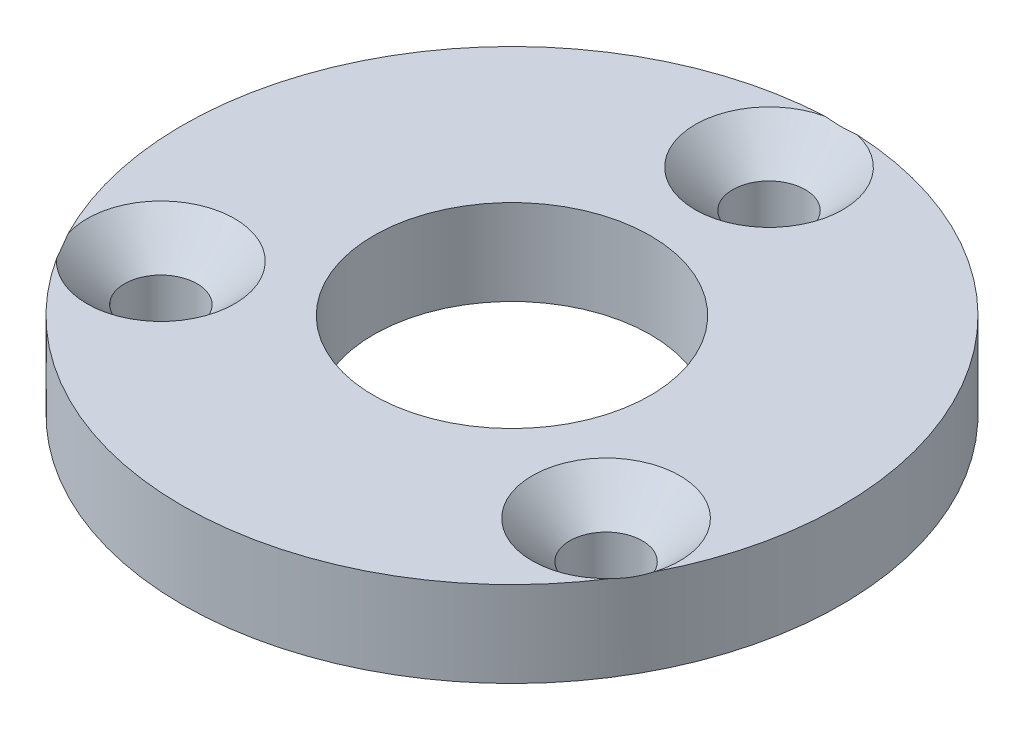
ISO-10303-21;
HEADER;
FILE_DESCRIPTION(('STEP AP214'),'2;1');
FILE_NAME('part.step','',(''),(''),'','','');
FILE_SCHEMA(('AUTOMOTIVE_DESIGN { 1 0 10303 214 1 1 1 1 }'));
ENDSEC;
DATA;
#1=APPLICATION_CONTEXT('core data for automotive mechanical design processes');
#2=APPLICATION_PROTOCOL_DEFINITION('international standard','automotive_design',2000,#1);
#3=PRODUCT_CONTEXT('',#1,'mechanical');
#4=PRODUCT('Part','Part','',(#3));
#5=PRODUCT_RELATED_PRODUCT_CATEGORY('part','',(#4));
#6=PRODUCT_DEFINITION_FORMATION('','',#4);
#7=PRODUCT_DEFINITION_CONTEXT('part definition',#1,'design');
#8=PRODUCT_DEFINITION('design','',#6,#7);
#9=PRODUCT_DEFINITION_SHAPE('','',#8);
#10=(LENGTH_UNIT() NAMED_UNIT(*) SI_UNIT(.MILLI.,.METRE.));
#11=(NAMED_UNIT(*) PLANE_ANGLE_UNIT() SI_UNIT($,.RADIAN.));
#12=(NAMED_UNIT(*) SI_UNIT($,.STERADIAN.) SOLID_ANGLE_UNIT());
#13=UNCERTAINTY_MEASURE_WITH_UNIT(LENGTH_MEASURE(1.E-05),#10,'distance_accuracy_value','');
#14=(GEOMETRIC_REPRESENTATION_CONTEXT(3) GLOBAL_UNCERTAINTY_ASSIGNED_CONTEXT((#13)) GLOBAL_UNIT_ASSIGNED_CONTEXT((#10,
#11,#12)) REPRESENTATION_CONTEXT('',''));
#15=CARTESIAN_POINT('',(0.,0.,0.));
#16=DIRECTION('',(0.,0.,1.));
#17=DIRECTION('',(1.,0.,0.));
#18=AXIS2_PLACEMENT_3D('',#15,#16,#17);
#19=CARTESIAN_POINT('',(0.,6.5,0.));
#20=DIRECTION('',(0.,1.,0.));
#21=DIRECTION('',(0.,0.,1.));
#22=AXIS2_PLACEMENT_3D('',#19,#20,#21);
#23=PLANE('',#22);
#24=CARTESIAN_POINT('',(-16.8874953737966,6.5,9.74999999999984));
#25=DIRECTION('',(0.,1.,0.));
#26=DIRECTION('',(0.,0.,1.));
#27=AXIS2_PLACEMENT_3D('',#24,#25,#26);
#28=CIRCLE('',#27,5.6);
#29=CARTESIAN_POINT('',(-21.0296925270487,6.5,13.518580998677));
#30=VERTEX_POINT('',#29);
#31=CARTESIAN_POINT('',(-22.2222808314964,6.5,11.4529574628612));
#32=VERTEX_POINT('',#31);
#33=EDGE_CURVE('E63',#30,#32,#28,.T.);
#34=ORIENTED_EDGE('',*,*,#33,.F.);
#35=CARTESIAN_POINT('',(0.,6.5,0.));
#36=DIRECTION('',(0.,1.,0.));
#37=DIRECTION('',(0.,0.,1.));
#38=AXIS2_PLACEMENT_3D('',#35,#36,#37);
#39=CIRCLE('',#38,25.);
#40=CARTESIAN_POINT('',(21.0296925270486,6.5,13.5185809986772));
#41=VERTEX_POINT('',#40);
#42=EDGE_CURVE('E69',#30,#41,#39,.T.);
#43=ORIENTED_EDGE('',*,*,#42,.T.);
#44=CARTESIAN_POINT('',(16.8874953737965,6.5,9.75000000000008));
#45=DIRECTION('',(0.,1.,0.));
#46=DIRECTION('',(0.,0.,1.));
#47=AXIS2_PLACEMENT_3D('',#44,#45,#46);
#48=CIRCLE('',#47,5.6);
#49=CARTESIAN_POINT('',(22.2222808314963,6.5,11.4529574628614));
#50=VERTEX_POINT('',#49);
#51=EDGE_CURVE('E168',#50,#41,#48,.T.);
#52=ORIENTED_EDGE('',*,*,#51,.F.);
#53=CARTESIAN_POINT('',(1.19258830444764,6.5,-24.9715384615385));
#54=VERTEX_POINT('',#53);
#55=EDGE_CURVE('E93',#50,#54,#39,.T.);
#56=ORIENTED_EDGE('',*,*,#55,.T.);
#57=CARTESIAN_POINT('',(0.,6.5,-19.5));
#58=DIRECTION('',(0.,1.,0.));
#59=DIRECTION('',(0.,0.,1.));
#60=AXIS2_PLACEMENT_3D('',#57,#58,#59);
#61=CIRCLE('',#60,5.6);
#62=CARTESIAN_POINT('',(-1.19258830444772,6.5,-24.9715384615384));
#63=VERTEX_POINT('',#62);
#64=EDGE_CURVE('E159',#63,#54,#61,.T.);
#65=ORIENTED_EDGE('',*,*,#64,.F.);
#66=EDGE_CURVE('E87',#63,#32,#39,.T.);
#67=ORIENTED_EDGE('',*,*,#66,.T.);
#68=EDGE_LOOP('',(#34,#43,#52,#56,#65,#67));
#69=FACE_BOUND('',#68,.T.);
#70=CARTESIAN_POINT('',(0.,6.5,0.));
#71=DIRECTION('',(0.,1.,0.));
#72=DIRECTION('',(0.,0.,1.));
#73=AXIS2_PLACEMENT_3D('',#70,#71,#72);
#74=CIRCLE('',#73,10.5);
#75=CARTESIAN_POINT('',(0.,6.5,-10.5));
#76=VERTEX_POINT('',#75);
#77=EDGE_CURVE('E103',#76,#76,#74,.T.);
#78=ORIENTED_EDGE('',*,*,#77,.F.);
#79=EDGE_LOOP('',(#78));
#80=FACE_BOUND('',#79,.T.);
#81=ADVANCED_FACE('F43',(#69,#80),#23,.T.);
#82=CARTESIAN_POINT('',(0.,0.,0.));
#83=DIRECTION('',(0.,1.,0.));
#84=DIRECTION('',(0.,0.,1.));
#85=AXIS2_PLACEMENT_3D('',#82,#83,#84);
#86=PLANE('',#85);
#87=CARTESIAN_POINT('',(-16.8874953737966,0.,9.74999999999984));
#88=DIRECTION('',(0.,1.,0.));
#89=DIRECTION('',(0.,0.,1.));
#90=AXIS2_PLACEMENT_3D('',#87,#88,#89);
#91=CIRCLE('',#90,2.75);
#92=CARTESIAN_POINT('',(-16.8874953737966,0.,12.4999999999998));
#93=VERTEX_POINT('',#92);
#94=EDGE_CURVE('E141',#93,#93,#91,.T.);
#95=ORIENTED_EDGE('',*,*,#94,.T.);
#96=EDGE_LOOP('',(#95));
#97=FACE_BOUND('',#96,.T.);
#98=CARTESIAN_POINT('',(16.8874953737965,0.,9.75000000000008));
#99=DIRECTION('',(0.,1.,0.));
#100=DIRECTION('',(0.,0.,1.));
#101=AXIS2_PLACEMENT_3D('',#98,#99,#100);
#102=CIRCLE('',#101,2.75);
#103=CARTESIAN_POINT('',(16.8874953737965,0.,12.5000000000001));
#104=VERTEX_POINT('',#103);
#105=EDGE_CURVE('E145',#104,#104,#102,.T.);
#106=ORIENTED_EDGE('',*,*,#105,.T.);
#107=EDGE_LOOP('',(#106));
#108=FACE_BOUND('',#107,.T.);
#109=CARTESIAN_POINT('',(0.,0.,-19.5));
#110=DIRECTION('',(0.,1.,0.));
#111=DIRECTION('',(0.,0.,1.));
#112=AXIS2_PLACEMENT_3D('',#109,#110,#111);
#113=CIRCLE('',#112,2.75);
#114=CARTESIAN_POINT('',(0.,0.,-16.75));
#115=VERTEX_POINT('',#114);
#116=EDGE_CURVE('E149',#115,#115,#113,.T.);
#117=ORIENTED_EDGE('',*,*,#116,.T.);
#118=EDGE_LOOP('',(#117));
#119=FACE_BOUND('',#118,.T.);
#120=CARTESIAN_POINT('',(0.,0.,0.));
#121=DIRECTION('',(0.,1.,0.));
#122=DIRECTION('',(0.,0.,1.));
#123=AXIS2_PLACEMENT_3D('',#120,#121,#122);
#124=CIRCLE('',#123,25.);
#125=CARTESIAN_POINT('',(0.,0.,25.));
#126=VERTEX_POINT('',#125);
#127=EDGE_CURVE('E96',#126,#126,#124,.T.);
#128=ORIENTED_EDGE('',*,*,#127,.F.);
#129=EDGE_LOOP('',(#128));
#130=FACE_BOUND('',#129,.T.);
#131=CARTESIAN_POINT('',(0.,0.,0.));
#132=DIRECTION('',(0.,1.,0.));
#133=DIRECTION('',(0.,0.,1.));
#134=AXIS2_PLACEMENT_3D('',#131,#132,#133);
#135=CIRCLE('',#134,10.5);
#136=CARTESIAN_POINT('',(0.,0.,-10.5));
#137=VERTEX_POINT('',#136);
#138=EDGE_CURVE('E99',#137,#137,#135,.T.);
#139=ORIENTED_EDGE('',*,*,#138,.T.);
#140=EDGE_LOOP('',(#139));
#141=FACE_BOUND('',#140,.T.);
#142=ADVANCED_FACE('F132',(#97,#108,#119,#130,#141),#86,.F.);
#143=CARTESIAN_POINT('',(0.,6.5,0.));
#144=DIRECTION('',(0.,-1.,0.));
#145=DIRECTION('',(0.,0.,-1.));
#146=AXIS2_PLACEMENT_3D('',#143,#144,#145);
#147=CYLINDRICAL_SURFACE('',#146,25.);
#148=ORIENTED_EDGE('',*,*,#42,.F.);
#149=CARTESIAN_POINT('',(-17.927073801232,8.64478401629333,17.4246958345098));
#150=CARTESIAN_POINT('',(-18.0361968243042,8.54819589595198,17.3124221484397));
#151=CARTESIAN_POINT('',(-18.144820406766,8.45286492083121,17.198560881914));
#152=CARTESIAN_POINT('',(-18.3611373090782,8.26522878693702,16.9674317320035));
#153=CARTESIAN_POINT('',(-18.4688303572154,8.17292449132593,16.8501628945102));
#154=CARTESIAN_POINT('',(-18.6839362345262,7.99136567461168,16.611336404931));
#155=CARTESIAN_POINT('',(-18.7913435098031,7.90213276356399,16.48975724964));
#156=CARTESIAN_POINT('',(-19.0052445867549,7.72801026314842,16.2427637082828));
#157=CARTESIAN_POINT('',(-19.1117384645833,7.64312030870229,16.1173496460078));
#158=CARTESIAN_POINT('',(-19.3247943740408,7.47777476713479,15.8612829908372));
#159=CARTESIAN_POINT('',(-19.4313485408889,7.39736548693882,15.7305936500127));
#160=CARTESIAN_POINT('',(-19.6435347902216,7.24286170424409,15.4648145484702));
#161=CARTESIAN_POINT('',(-19.7491667340311,7.16876813724705,15.3297241399352));
#162=CARTESIAN_POINT('',(-20.064098424858,6.95814140611993,14.9181417102118));
#163=CARTESIAN_POINT('',(-20.2720884137402,6.83274033112642,14.6345555943163));
#164=CARTESIAN_POINT('',(-20.5238814961714,6.70459165063312,14.2750454113065));
#165=CARTESIAN_POINT('',(-20.57041679627,6.68192035509554,14.2079090387369));
#166=CARTESIAN_POINT('',(-20.6631720417593,6.63889793047044,14.072670013618));
#167=CARTESIAN_POINT('',(-20.7093919760469,6.61854688268003,14.0045673273049));
#168=CARTESIAN_POINT('',(-20.801420330688,6.58033657142761,13.867505822086));
#169=CARTESIAN_POINT('',(-20.8472291517469,6.56247456024489,13.7985480402441));
#170=CARTESIAN_POINT('',(-20.9384470022222,6.52935161073006,13.659734286913));
#171=CARTESIAN_POINT('',(-20.983855951641,6.51409118213649,13.5898781422809));
#172=CARTESIAN_POINT('',(-21.1355317889478,6.46746245044068,13.3539519830683));
#173=CARTESIAN_POINT('',(-21.2407824447946,6.44232983668392,13.1859296161727));
#174=CARTESIAN_POINT('',(-21.4479761035329,6.4086204528431,12.8461639148478));
#175=CARTESIAN_POINT('',(-21.549918214085,6.40004811329962,12.6744195970709));
#176=CARTESIAN_POINT('',(-21.749929738473,6.3999521632574,12.3280436331305));
#177=CARTESIAN_POINT('',(-21.8479875870741,6.40847605794567,12.1534052825905));
#178=CARTESIAN_POINT('',(-22.0392026272085,6.44218409839087,11.8031081343519));
#179=CARTESIAN_POINT('',(-22.1323606039082,6.46736556606721,11.6274495051852));
#180=CARTESIAN_POINT('',(-22.2854561166011,6.52292785459346,11.3303646188317));
#181=CARTESIAN_POINT('',(-22.3467929359788,6.54932251250805,11.2088879144097));
#182=CARTESIAN_POINT('',(-22.4668556708076,6.60886172351805,10.9662535405045));
#183=CARTESIAN_POINT('',(-22.5255808325069,6.6420082100561,10.8450959724978));
#184=CARTESIAN_POINT('',(-22.6401245200141,6.71424251572034,10.603891423431));
#185=CARTESIAN_POINT('',(-22.6959546208646,6.75330375251438,10.483841902959));
#186=CARTESIAN_POINT('',(-22.8049798670255,6.83680345607456,10.2445193620224));
#187=CARTESIAN_POINT('',(-22.8581767359469,6.88123833807274,10.1252458792247));
#188=CARTESIAN_POINT('',(-22.9100929138685,6.92805208045218,10.0063800986128));
#189=B_SPLINE_CURVE_WITH_KNOTS('',3,(#149,#150,#151,#152,#153,#154,#155,#156,#157,#158,#159,
#160,#161,#162,#163,#164,#165,#166,#167,#168,#169,#170,#171,#172,#173,#174,#175,#176,#177,#178,
#179,#180,#181,#182,#183,#184,#185,#186,#187,#188),.UNSPECIFIED.,.F.,.F.,(4,2,2,2,2,2,2,2,2,2,2,
2,2,2,2,2,2,2,2,4),(0.,0.551896450653943,1.10394894846762,1.65931222798709,2.21462874551065,
2.77489849787784,3.33525109533037,4.45252771875488,4.7068301328258,4.96114145443761,
5.2151697717277,5.46924780474572,6.06803717458684,6.66698672253642,7.26760287313443,
7.86812248459939,8.28379958863711,8.6995958930541,9.11357612096312,9.52728168977826),.UNSPECIFIED.);
#190=EDGE_CURVE('E11',#30,#32,#189,.T.);
#191=ORIENTED_EDGE('',*,*,#190,.T.);
#192=ORIENTED_EDGE('',*,*,#66,.F.);
#193=CARTESIAN_POINT('',(-1.19379036571491,6.5002,-24.9714810246154));
#194=CARTESIAN_POINT('',(-1.09490451245829,6.4837346364128,-24.9762089754061));
#195=CARTESIAN_POINT('',(-0.995675873217254,6.46919992459855,-24.9803631946907));
#196=CARTESIAN_POINT('',(-0.796660258952436,6.44414930719041,-24.9875017906091));
#197=CARTESIAN_POINT('',(-0.696873221748359,6.43363385857493,-24.9904860342212));
#198=CARTESIAN_POINT('',(-0.398457557294305,6.40848900183163,-24.9976115952382));
#199=CARTESIAN_POINT('',(-0.199228778647153,6.4,-25.));
#200=CARTESIAN_POINT('',(0.199228778647151,6.4,-25.));
#201=CARTESIAN_POINT('',(0.398457557294303,6.40848900183163,-24.9976115952382));
#202=CARTESIAN_POINT('',(0.696873221748357,6.43363385857493,-24.9904860342212));
#203=CARTESIAN_POINT('',(0.796660258952434,6.44414930719041,-24.9875017906091));
#204=CARTESIAN_POINT('',(0.995675873217252,6.46919992459855,-24.9803631946907));
#205=CARTESIAN_POINT('',(1.09490451245829,6.4837346364128,-24.9762089754061));
#206=CARTESIAN_POINT('',(1.19379036571491,6.5002,-24.9714810246154));
#207=B_SPLINE_CURVE_WITH_KNOTS('',3,(#193,#194,#195,#196,#197,#198,#199,#200,#201,#202,#203,
#204,#205,#206),.UNSPECIFIED.,.F.,.F.,(4,2,2,2,2,2,4),(0.,0.301040027809255,0.602114272809818,
1.19957076655876,1.7970272603077,2.09810150530826,2.39914153311751),.UNSPECIFIED.);
#208=EDGE_CURVE('E95',#63,#54,#207,.T.);
#209=ORIENTED_EDGE('',*,*,#208,.T.);
#210=ORIENTED_EDGE('',*,*,#55,.F.);
#211=CARTESIAN_POINT('',(22.9100929138683,6.92805208045218,10.0063800986131));
#212=CARTESIAN_POINT('',(22.8581625436058,6.88122554289352,10.1252783729003));
#213=CARTESIAN_POINT('',(22.8049507754517,6.83677915775083,10.2445845881658));
#214=CARTESIAN_POINT('',(22.6958943477128,6.75325961170049,10.4839728406724));
#215=CARTESIAN_POINT('',(22.6400479663023,6.71419003194904,10.6040553397459));
#216=CARTESIAN_POINT('',(22.5255014502299,6.64196237723371,10.8452604099265));
#217=CARTESIAN_POINT('',(22.4667911801805,6.60882757974003,10.9663852042442));
#218=CARTESIAN_POINT('',(22.3467596732269,6.54930818257731,11.208953798958));
#219=CARTESIAN_POINT('',(22.2854391873835,6.52292165627886,11.3303974982811));
#220=CARTESIAN_POINT('',(22.132362467658,6.46736632088829,11.6274458481297));
#221=CARTESIAN_POINT('',(22.0392062562631,6.44218539490645,11.8031011310082));
#222=CARTESIAN_POINT('',(21.8480042611384,6.40847834059972,12.1533750915569));
#223=CARTESIAN_POINT('',(21.7499580999661,6.39995349996121,12.3279936880404));
#224=CARTESIAN_POINT('',(21.5499661949759,6.40004674435931,12.6743373312703));
#225=CARTESIAN_POINT('',(21.4480320435749,6.40861726165023,12.8460690698964));
#226=CARTESIAN_POINT('',(21.240837303161,6.44231500327774,13.1858427673336));
#227=CARTESIAN_POINT('',(21.1355764594406,6.46744349831066,13.3538844419382));
#228=CARTESIAN_POINT('',(20.9002358329357,6.53980429040934,13.7199437982655));
#229=CARTESIAN_POINT('',(20.7695677747001,6.59055923913521,13.9168841716957));
#230=CARTESIAN_POINT('',(20.5055914234885,6.71112377601981,14.3029888474597));
#231=CARTESIAN_POINT('',(20.3722821606673,6.78094048856039,14.4921502118932));
#232=CARTESIAN_POINT('',(20.1028008191324,6.93667646537867,14.8637292749922));
#233=CARTESIAN_POINT('',(19.9666153392403,7.02270343348171,15.0460914856964));
#234=CARTESIAN_POINT('',(19.6926289049026,7.20734191114836,15.4029535894019));
#235=CARTESIAN_POINT('',(19.5548281265856,7.30595206005074,15.5774543297337));
#236=CARTESIAN_POINT('',(19.2936522256341,7.50121143717568,15.8994612729767));
#237=CARTESIAN_POINT('',(19.1704419007171,7.59678045327812,16.0477630607591));
#238=CARTESIAN_POINT('',(18.9228121846757,7.79427122769477,16.3390242636017));
#239=CARTESIAN_POINT('',(18.7983927525808,7.89619320191616,16.4819834968291));
#240=CARTESIAN_POINT('',(18.5501944301737,8.10362530991942,16.7608058411849));
#241=CARTESIAN_POINT('',(18.4264342191816,8.20905806042494,16.8967434921256));
#242=CARTESIAN_POINT('',(18.1776941739206,8.4240394906202,17.1640519287931));
#243=CARTESIAN_POINT('',(18.0527148216668,8.53358658883694,17.2954244326346));
#244=CARTESIAN_POINT('',(17.9270738012318,8.64478401629325,17.4246958345099));
#245=B_SPLINE_CURVE_WITH_KNOTS('',3,(#211,#212,#213,#214,#215,#216,#217,#218,#219,#220,#221,
#222,#223,#224,#225,#226,#227,#228,#229,#230,#231,#232,#233,#234,#235,#236,#237,#238,#239,#240,
#241,#242,#243,#244),.UNSPECIFIED.,.F.,.F.,(4,2,2,2,2,2,2,2,2,2,2,2,2,2,2,2,4),(0.,
0.413818685608905,0.827911669873517,1.24359485035634,1.65915922059644,2.25966593609579,
2.86021907509177,3.45910350907513,4.05803390814595,4.78217147584908,5.50658006315347,
6.235983250973,6.9653076327293,7.61070345413385,8.25612122148052,8.8917967788851,
9.52723044699122),.UNSPECIFIED.);
#246=EDGE_CURVE('E57',#50,#41,#245,.T.);
#247=ORIENTED_EDGE('',*,*,#246,.T.);
#248=EDGE_LOOP('',(#148,#191,#192,#209,#210,#247));
#249=FACE_BOUND('',#248,.T.);
#250=ORIENTED_EDGE('',*,*,#127,.T.);
#251=EDGE_LOOP('',(#250));
#252=FACE_BOUND('',#251,.T.);
#253=ADVANCED_FACE('F45',(#249,#252),#147,.T.);
#254=CARTESIAN_POINT('',(0.,6.5,0.));
#255=DIRECTION('',(0.,-1.,0.));
#256=DIRECTION('',(0.,0.,-1.));
#257=AXIS2_PLACEMENT_3D('',#254,#255,#256);
#258=CYLINDRICAL_SURFACE('',#257,10.5);
#259=CARTESIAN_POINT('',(0.,6.5,-10.5));
#260=CARTESIAN_POINT('',(0.,6.43229166666667,-10.5));
#261=CARTESIAN_POINT('',(0.,6.36458333333333,-10.5));
#262=CARTESIAN_POINT('',(0.,6.22916666666667,-10.5));
#263=CARTESIAN_POINT('',(0.,6.16145833333333,-10.5));
#264=CARTESIAN_POINT('',(0.,6.02604166666667,-10.5));
#265=CARTESIAN_POINT('',(0.,5.95833333333333,-10.5));
#266=CARTESIAN_POINT('',(0.,5.82291666666667,-10.5));
#267=CARTESIAN_POINT('',(0.,5.75520833333333,-10.5));
#268=CARTESIAN_POINT('',(0.,5.61979166666667,-10.5));
#269=CARTESIAN_POINT('',(0.,5.55208333333333,-10.5));
#270=CARTESIAN_POINT('',(0.,5.41666666666667,-10.5));
#271=CARTESIAN_POINT('',(0.,5.34895833333333,-10.5));
#272=CARTESIAN_POINT('',(0.,5.21354166666667,-10.5));
#273=CARTESIAN_POINT('',(0.,5.14583333333333,-10.5));
#274=CARTESIAN_POINT('',(0.,5.01041666666667,-10.5));
#275=CARTESIAN_POINT('',(0.,4.94270833333333,-10.5));
#276=CARTESIAN_POINT('',(0.,4.80729166666667,-10.5));
#277=CARTESIAN_POINT('',(0.,4.73958333333333,-10.5));
#278=CARTESIAN_POINT('',(0.,4.60416666666667,-10.5));
#279=CARTESIAN_POINT('',(0.,4.53645833333333,-10.5));
#280=CARTESIAN_POINT('',(0.,4.40104166666667,-10.5));
#281=CARTESIAN_POINT('',(0.,4.33333333333333,-10.5));
#282=CARTESIAN_POINT('',(0.,4.19791666666667,-10.5));
#283=CARTESIAN_POINT('',(0.,4.13020833333333,-10.5));
#284=CARTESIAN_POINT('',(0.,3.99479166666667,-10.5));
#285=CARTESIAN_POINT('',(0.,3.92708333333333,-10.5));
#286=CARTESIAN_POINT('',(0.,3.79166666666667,-10.5));
#287=CARTESIAN_POINT('',(0.,3.72395833333333,-10.5));
#288=CARTESIAN_POINT('',(0.,3.58854166666667,-10.5));
#289=CARTESIAN_POINT('',(0.,3.52083333333333,-10.5));
#290=CARTESIAN_POINT('',(0.,3.38541666666667,-10.5));
#291=CARTESIAN_POINT('',(0.,3.31770833333333,-10.5));
#292=CARTESIAN_POINT('',(0.,3.18229166666667,-10.5));
#293=CARTESIAN_POINT('',(0.,3.11458333333333,-10.5));
#294=CARTESIAN_POINT('',(0.,2.97916666666667,-10.5));
#295=CARTESIAN_POINT('',(0.,2.91145833333333,-10.5));
#296=CARTESIAN_POINT('',(0.,2.77604166666667,-10.5));
#297=CARTESIAN_POINT('',(0.,2.70833333333333,-10.5));
#298=CARTESIAN_POINT('',(0.,2.57291666666667,-10.5));
#299=CARTESIAN_POINT('',(0.,2.50520833333333,-10.5));
#300=CARTESIAN_POINT('',(0.,2.36979166666667,-10.5));
#301=CARTESIAN_POINT('',(0.,2.30208333333333,-10.5));
#302=CARTESIAN_POINT('',(0.,2.16666666666667,-10.5));
#303=CARTESIAN_POINT('',(0.,2.09895833333333,-10.5));
#304=CARTESIAN_POINT('',(0.,1.96354166666667,-10.5));
#305=CARTESIAN_POINT('',(0.,1.89583333333333,-10.5));
#306=CARTESIAN_POINT('',(0.,1.76041666666667,-10.5));
#307=CARTESIAN_POINT('',(0.,1.69270833333333,-10.5));
#308=CARTESIAN_POINT('',(0.,1.55729166666667,-10.5));
#309=CARTESIAN_POINT('',(0.,1.48958333333333,-10.5));
#310=CARTESIAN_POINT('',(0.,1.35416666666667,-10.5));
#311=CARTESIAN_POINT('',(0.,1.28645833333333,-10.5));
#312=CARTESIAN_POINT('',(0.,1.15104166666667,-10.5));
#313=CARTESIAN_POINT('',(0.,1.08333333333333,-10.5));
#314=CARTESIAN_POINT('',(0.,0.947916666666667,-10.5));
#315=CARTESIAN_POINT('',(0.,0.880208333333333,-10.5));
#316=CARTESIAN_POINT('',(0.,0.744791666666667,-10.5));
#317=CARTESIAN_POINT('',(0.,0.677083333333333,-10.5));
#318=CARTESIAN_POINT('',(0.,0.541666666666667,-10.5));
#319=CARTESIAN_POINT('',(0.,0.473958333333333,-10.5));
#320=CARTESIAN_POINT('',(0.,0.338541666666667,-10.5));
#321=CARTESIAN_POINT('',(0.,0.270833333333334,-10.5));
#322=CARTESIAN_POINT('',(0.,0.135416666666667,-10.5));
#323=CARTESIAN_POINT('',(0.,0.0677083333333334,-10.5));
#324=CARTESIAN_POINT('',(0.,0.,-10.5));
#325=B_SPLINE_CURVE_WITH_KNOTS('',3,(#259,#260,#261,#262,#263,#264,#265,#266,#267,#268,#269,
#270,#271,#272,#273,#274,#275,#276,#277,#278,#279,#280,#281,#282,#283,#284,#285,#286,#287,#288,
#289,#290,#291,#292,#293,#294,#295,#296,#297,#298,#299,#300,#301,#302,#303,#304,#305,#306,#307,
#308,#309,#310,#311,#312,#313,#314,#315,#316,#317,#318,#319,#320,#321,#322,#323,#324),
.UNSPECIFIED.,.F.,.F.,(4,2,2,2,2,2,2,2,2,2,2,2,2,2,2,2,2,2,2,2,2,2,2,2,2,2,2,2,2,2,2,2,4),(0.,
0.203124999999999,0.40625,0.609375,0.812499999999999,1.015625,1.21875,1.421875,1.625,1.828125,
2.03125,2.234375,2.4375,2.640625,2.84375,3.046875,3.25,3.453125,3.65625,3.859375,4.0625,
4.265625,4.46875,4.671875,4.875,5.078125,5.28125,5.484375,5.6875,5.890625,6.09375,6.296875,6.5),.UNSPECIFIED.);
#326=EDGE_CURVE('BSEAM121',#76,#137,#325,.T.);
#327=ORIENTED_EDGE('',*,*,#77,.T.);
#328=ORIENTED_EDGE('',*,*,#138,.F.);
#329=ORIENTED_EDGE('',*,*,#326,.T.);
#330=ORIENTED_EDGE('',*,*,#326,.F.);
#331=EDGE_LOOP('',(#327,#329,#328,#330));
#332=FACE_BOUND('',#331,.T.);
#333=ADVANCED_FACE('F121',(#332),#258,.F.);
#334=CARTESIAN_POINT('',(0.,6.5,-19.5));
#335=DIRECTION('',(0.,1.,0.));
#336=DIRECTION('',(0.,0.,1.));
#337=AXIS2_PLACEMENT_3D('',#334,#335,#336);
#338=CONICAL_SURFACE('',#337,5.6,0.785398163397449);
#339=CARTESIAN_POINT('',(0.,3.65,-19.5));
#340=DIRECTION('',(0.,1.,0.));
#341=DIRECTION('',(0.,0.,1.));
#342=AXIS2_PLACEMENT_3D('',#339,#340,#341);
#343=CIRCLE('',#342,2.75);
#344=CARTESIAN_POINT('',(0.,3.65,-16.75));
#345=VERTEX_POINT('',#344);
#346=EDGE_CURVE('E156',#345,#345,#343,.T.);
#347=ORIENTED_EDGE('',*,*,#346,.F.);
#348=EDGE_LOOP('',(#347));
#349=FACE_BOUND('',#348,.T.);
#350=ORIENTED_EDGE('',*,*,#64,.T.);
#351=ORIENTED_EDGE('',*,*,#208,.F.);
#352=EDGE_LOOP('',(#350,#351));
#353=FACE_BOUND('',#352,.T.);
#354=ADVANCED_FACE('F115',(#349,#353),#338,.F.);
#355=CARTESIAN_POINT('',(0.,6.5,-19.5));
#356=DIRECTION('',(0.,1.,0.));
#357=DIRECTION('',(0.,0.,1.));
#358=AXIS2_PLACEMENT_3D('',#355,#356,#357);
#359=CYLINDRICAL_SURFACE('',#358,2.75);
#360=ORIENTED_EDGE('',*,*,#116,.F.);
#361=EDGE_LOOP('',(#360));
#362=FACE_BOUND('',#361,.T.);
#363=ORIENTED_EDGE('',*,*,#346,.T.);
#364=EDGE_LOOP('',(#363));
#365=FACE_BOUND('',#364,.T.);
#366=ADVANCED_FACE('F120',(#362,#365),#359,.F.);
#367=CARTESIAN_POINT('',(16.8874953737965,6.5,9.75000000000008));
#368=DIRECTION('',(0.,1.,0.));
#369=DIRECTION('',(0.,0.,1.));
#370=AXIS2_PLACEMENT_3D('',#367,#368,#369);
#371=CONICAL_SURFACE('',#370,5.6,0.785398163397449);
#372=CARTESIAN_POINT('',(16.8874953737965,3.65,9.75000000000008));
#373=DIRECTION('',(0.,1.,0.));
#374=DIRECTION('',(0.,0.,1.));
#375=AXIS2_PLACEMENT_3D('',#372,#373,#374);
#376=CIRCLE('',#375,2.75);
#377=CARTESIAN_POINT('',(16.8874953737965,3.65,12.5000000000001));
#378=VERTEX_POINT('',#377);
#379=EDGE_CURVE('E165',#378,#378,#376,.T.);
#380=ORIENTED_EDGE('',*,*,#379,.F.);
#381=EDGE_LOOP('',(#380));
#382=FACE_BOUND('',#381,.T.);
#383=ORIENTED_EDGE('',*,*,#51,.T.);
#384=ORIENTED_EDGE('',*,*,#246,.F.);
#385=EDGE_LOOP('',(#383,#384));
#386=FACE_BOUND('',#385,.T.);
#387=ADVANCED_FACE('F126',(#382,#386),#371,.F.);
#388=CARTESIAN_POINT('',(16.8874953737965,6.5,9.75000000000008));
#389=DIRECTION('',(0.,1.,0.));
#390=DIRECTION('',(0.,0.,1.));
#391=AXIS2_PLACEMENT_3D('',#388,#389,#390);
#392=CYLINDRICAL_SURFACE('',#391,2.75);
#393=ORIENTED_EDGE('',*,*,#105,.F.);
#394=EDGE_LOOP('',(#393));
#395=FACE_BOUND('',#394,.T.);
#396=ORIENTED_EDGE('',*,*,#379,.T.);
#397=EDGE_LOOP('',(#396));
#398=FACE_BOUND('',#397,.T.);
#399=ADVANCED_FACE('F123',(#395,#398),#392,.F.);
#400=CARTESIAN_POINT('',(-16.8874953737966,6.5,9.74999999999984));
#401=DIRECTION('',(0.,1.,0.));
#402=DIRECTION('',(0.,0.,1.));
#403=AXIS2_PLACEMENT_3D('',#400,#401,#402);
#404=CONICAL_SURFACE('',#403,5.6,0.785398163397449);
#405=CARTESIAN_POINT('',(-16.8874953737966,3.65,9.74999999999984));
#406=DIRECTION('',(0.,1.,0.));
#407=DIRECTION('',(0.,0.,1.));
#408=AXIS2_PLACEMENT_3D('',#405,#406,#407);
#409=CIRCLE('',#408,2.75);
#410=CARTESIAN_POINT('',(-16.8874953737966,3.65,12.4999999999998));
#411=VERTEX_POINT('',#410);
#412=EDGE_CURVE('E88',#411,#411,#409,.T.);
#413=ORIENTED_EDGE('',*,*,#412,.F.);
#414=EDGE_LOOP('',(#413));
#415=FACE_BOUND('',#414,.T.);
#416=ORIENTED_EDGE('',*,*,#33,.T.);
#417=ORIENTED_EDGE('',*,*,#190,.F.);
#418=EDGE_LOOP('',(#416,#417));
#419=FACE_BOUND('',#418,.T.);
#420=ADVANCED_FACE('F81',(#415,#419),#404,.F.);
#421=CARTESIAN_POINT('',(-16.8874953737966,6.5,9.74999999999984));
#422=DIRECTION('',(0.,1.,0.));
#423=DIRECTION('',(0.,0.,1.));
#424=AXIS2_PLACEMENT_3D('',#421,#422,#423);
#425=CYLINDRICAL_SURFACE('',#424,2.75);
#426=ORIENTED_EDGE('',*,*,#94,.F.);
#427=EDGE_LOOP('',(#426));
#428=FACE_BOUND('',#427,.T.);
#429=ORIENTED_EDGE('',*,*,#412,.T.);
#430=EDGE_LOOP('',(#429));
#431=FACE_BOUND('',#430,.T.);
#432=ADVANCED_FACE('F174',(#428,#431),#425,.F.);
#433=CLOSED_SHELL('',(#81,#142,#253,#333,#354,#366,#387,#399,#420,#432));
#434=MANIFOLD_SOLID_BREP('B2',#433);
#435=ADVANCED_BREP_SHAPE_REPRESENTATION('',(#18,#434),#14);
#436=SHAPE_DEFINITION_REPRESENTATION(#9,#435);
ENDSEC;
END-ISO-10303-21;
